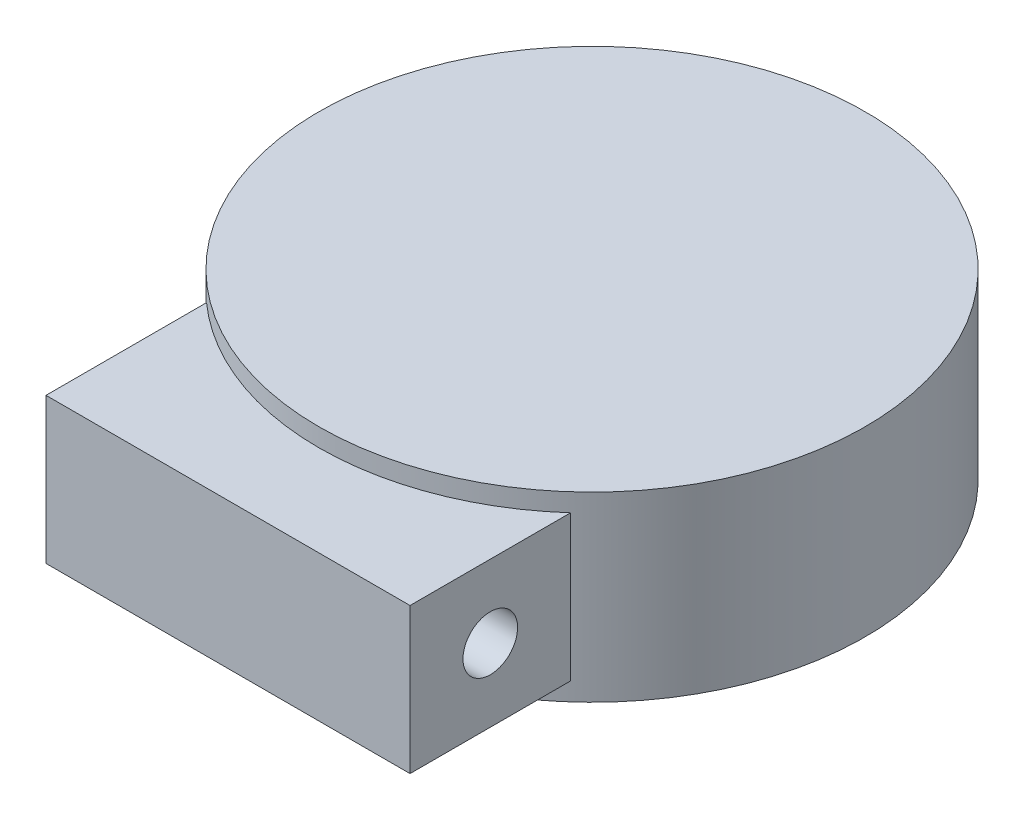
ISO-10303-21;
HEADER;
FILE_DESCRIPTION(('STEP AP214'),'2;1');
FILE_NAME('part.step','',(''),(''),'','','');
FILE_SCHEMA(('AUTOMOTIVE_DESIGN { 1 0 10303 214 1 1 1 1 }'));
ENDSEC;
DATA;
#1=APPLICATION_CONTEXT('core data for automotive mechanical design processes');
#2=APPLICATION_PROTOCOL_DEFINITION('international standard','automotive_design',2000,#1);
#3=PRODUCT_CONTEXT('',#1,'mechanical');
#4=PRODUCT('Part','Part','',(#3));
#5=PRODUCT_RELATED_PRODUCT_CATEGORY('part','',(#4));
#6=PRODUCT_DEFINITION_FORMATION('','',#4);
#7=PRODUCT_DEFINITION_CONTEXT('part definition',#1,'design');
#8=PRODUCT_DEFINITION('design','',#6,#7);
#9=PRODUCT_DEFINITION_SHAPE('','',#8);
#10=(LENGTH_UNIT() NAMED_UNIT(*) SI_UNIT(.MILLI.,.METRE.));
#11=(NAMED_UNIT(*) PLANE_ANGLE_UNIT() SI_UNIT($,.RADIAN.));
#12=(NAMED_UNIT(*) SI_UNIT($,.STERADIAN.) SOLID_ANGLE_UNIT());
#13=UNCERTAINTY_MEASURE_WITH_UNIT(LENGTH_MEASURE(1.E-05),#10,'distance_accuracy_value','');
#14=(GEOMETRIC_REPRESENTATION_CONTEXT(3) GLOBAL_UNCERTAINTY_ASSIGNED_CONTEXT((#13)) GLOBAL_UNIT_ASSIGNED_CONTEXT((#10,
#11,#12)) REPRESENTATION_CONTEXT('',''));
#15=CARTESIAN_POINT('',(0.,0.,0.));
#16=DIRECTION('',(0.,0.,1.));
#17=DIRECTION('',(1.,0.,0.));
#18=AXIS2_PLACEMENT_3D('',#15,#16,#17);
#19=CARTESIAN_POINT('',(0.,25.4,0.));
#20=DIRECTION('',(0.,-1.,0.));
#21=DIRECTION('',(0.,0.,-1.));
#22=AXIS2_PLACEMENT_3D('',#19,#20,#21);
#23=CYLINDRICAL_SURFACE('',#22,38.1);
#24=CARTESIAN_POINT('',(0.,0.,0.));
#25=DIRECTION('',(0.,1.,0.));
#26=DIRECTION('',(0.,0.,1.));
#27=AXIS2_PLACEMENT_3D('',#24,#25,#26);
#28=CIRCLE('',#27,38.1);
#29=CARTESIAN_POINT('',(0.,0.,38.1));
#30=VERTEX_POINT('',#29);
#31=EDGE_CURVE('E92',#30,#30,#28,.T.);
#32=ORIENTED_EDGE('',*,*,#31,.T.);
#33=EDGE_LOOP('',(#32));
#34=FACE_BOUND('',#33,.T.);
#35=CARTESIAN_POINT('',(0.,25.4,0.));
#36=DIRECTION('',(0.,1.,0.));
#37=DIRECTION('',(0.,0.,1.));
#38=AXIS2_PLACEMENT_3D('',#35,#36,#37);
#39=CIRCLE('',#38,38.1);
#40=CARTESIAN_POINT('',(0.,25.4,38.1));
#41=VERTEX_POINT('',#40);
#42=EDGE_CURVE('E95',#41,#41,#39,.T.);
#43=ORIENTED_EDGE('',*,*,#42,.F.);
#44=EDGE_LOOP('',(#43));
#45=FACE_BOUND('',#44,.T.);
#46=DIRECTION('',(0.,-1.,0.));
#47=VECTOR('',#46,1.);
#48=CARTESIAN_POINT('',(-25.4,25.4,28.3980633142473));
#49=LINE('',#48,#47);
#50=CARTESIAN_POINT('',(-25.4,22.86,28.3980633142473));
#51=VERTEX_POINT('',#50);
#52=CARTESIAN_POINT('',(-25.4,2.53999999999999,28.3980633142473));
#53=VERTEX_POINT('',#52);
#54=EDGE_CURVE('E11',#51,#53,#49,.T.);
#55=ORIENTED_EDGE('',*,*,#54,.F.);
#56=CARTESIAN_POINT('',(0.,22.86,0.));
#57=DIRECTION('',(0.,-1.,0.));
#58=DIRECTION('',(1.,0.,0.));
#59=AXIS2_PLACEMENT_3D('',#56,#57,#58);
#60=CIRCLE('',#59,38.1);
#61=CARTESIAN_POINT('',(25.4,22.86,28.3980633142473));
#62=VERTEX_POINT('',#61);
#63=EDGE_CURVE('E102',#62,#51,#60,.T.);
#64=ORIENTED_EDGE('',*,*,#63,.F.);
#65=DIRECTION('',(0.,-1.,0.));
#66=VECTOR('',#65,1.);
#67=CARTESIAN_POINT('',(25.4,25.4,28.3980633142473));
#68=LINE('',#67,#66);
#69=CARTESIAN_POINT('',(25.4,2.54,28.3980633142473));
#70=VERTEX_POINT('',#69);
#71=EDGE_CURVE('E51',#70,#62,#68,.F.);
#72=ORIENTED_EDGE('',*,*,#71,.F.);
#73=CARTESIAN_POINT('',(0.,2.54,0.));
#74=DIRECTION('',(0.,1.,0.));
#75=DIRECTION('',(-1.,0.,0.));
#76=AXIS2_PLACEMENT_3D('',#73,#74,#75);
#77=CIRCLE('',#76,38.1);
#78=EDGE_CURVE('E41',#53,#70,#77,.T.);
#79=ORIENTED_EDGE('',*,*,#78,.F.);
#80=EDGE_LOOP('',(#55,#64,#72,#79));
#81=FACE_BOUND('',#80,.T.);
#82=ADVANCED_FACE('F34',(#34,#45,#81),#23,.T.);
#83=CARTESIAN_POINT('',(0.,25.4,0.));
#84=DIRECTION('',(0.,1.,0.));
#85=DIRECTION('',(0.,0.,1.));
#86=AXIS2_PLACEMENT_3D('',#83,#84,#85);
#87=PLANE('',#86);
#88=ORIENTED_EDGE('',*,*,#42,.T.);
#89=EDGE_LOOP('',(#88));
#90=FACE_BOUND('',#89,.T.);
#91=ADVANCED_FACE('F117',(#90),#87,.T.);
#92=CARTESIAN_POINT('',(0.,0.,0.));
#93=DIRECTION('',(0.,1.,0.));
#94=DIRECTION('',(0.,0.,1.));
#95=AXIS2_PLACEMENT_3D('',#92,#93,#94);
#96=PLANE('',#95);
#97=ORIENTED_EDGE('',*,*,#31,.F.);
#98=EDGE_LOOP('',(#97));
#99=FACE_BOUND('',#98,.T.);
#100=ADVANCED_FACE('F122',(#99),#96,.F.);
#101=CARTESIAN_POINT('',(-25.4,22.86,50.8));
#102=DIRECTION('',(1.,0.,0.));
#103=DIRECTION('',(0.,1.,0.));
#104=AXIS2_PLACEMENT_3D('',#101,#102,#103);
#105=PLANE('',#104);
#106=CARTESIAN_POINT('',(-25.4,12.7,39.5990316571237));
#107=DIRECTION('',(-1.,0.,0.));
#108=DIRECTION('',(0.,-1.,0.));
#109=AXIS2_PLACEMENT_3D('',#106,#107,#108);
#110=CIRCLE('',#109,3.81);
#111=CARTESIAN_POINT('',(-25.4,8.88999999999999,39.5990316571237));
#112=VERTEX_POINT('',#111);
#113=EDGE_CURVE('E153',#112,#112,#110,.T.);
#114=ORIENTED_EDGE('',*,*,#113,.F.);
#115=EDGE_LOOP('',(#114));
#116=FACE_BOUND('',#115,.T.);
#117=DIRECTION('',(0.,0.,-1.));
#118=VECTOR('',#117,1.);
#119=CARTESIAN_POINT('',(-25.4,22.86,50.8));
#120=LINE('',#119,#118);
#121=CARTESIAN_POINT('',(-25.4,22.86,50.8));
#122=VERTEX_POINT('',#121);
#123=EDGE_CURVE('E111',#122,#51,#120,.T.);
#124=ORIENTED_EDGE('',*,*,#123,.T.);
#125=ORIENTED_EDGE('',*,*,#54,.T.);
#126=DIRECTION('',(0.,0.,-1.));
#127=VECTOR('',#126,1.);
#128=CARTESIAN_POINT('',(-25.4,2.53999999999999,50.8));
#129=LINE('',#128,#127);
#130=CARTESIAN_POINT('',(-25.4,2.53999999999999,50.8));
#131=VERTEX_POINT('',#130);
#132=EDGE_CURVE('E74',#131,#53,#129,.T.);
#133=ORIENTED_EDGE('',*,*,#132,.F.);
#134=DIRECTION('',(0.,-1.,0.));
#135=VECTOR('',#134,1.);
#136=CARTESIAN_POINT('',(-25.4,22.86,50.8));
#137=LINE('',#136,#135);
#138=EDGE_CURVE('E80',#122,#131,#137,.T.);
#139=ORIENTED_EDGE('',*,*,#138,.F.);
#140=EDGE_LOOP('',(#124,#125,#133,#139));
#141=FACE_BOUND('',#140,.T.);
#142=ADVANCED_FACE('F91',(#116,#141),#105,.F.);
#143=CARTESIAN_POINT('',(25.4,22.86,50.8));
#144=DIRECTION('',(-1.,0.,0.));
#145=DIRECTION('',(0.,-1.,0.));
#146=AXIS2_PLACEMENT_3D('',#143,#144,#145);
#147=PLANE('',#146);
#148=CARTESIAN_POINT('',(25.4,12.7,39.5990316571237));
#149=DIRECTION('',(-1.,0.,0.));
#150=DIRECTION('',(0.,-1.,0.));
#151=AXIS2_PLACEMENT_3D('',#148,#149,#150);
#152=CIRCLE('',#151,3.81);
#153=CARTESIAN_POINT('',(25.4,8.89,39.5990316571237));
#154=VERTEX_POINT('',#153);
#155=EDGE_CURVE('E89',#154,#154,#152,.F.);
#156=ORIENTED_EDGE('',*,*,#155,.F.);
#157=EDGE_LOOP('',(#156));
#158=FACE_BOUND('',#157,.T.);
#159=DIRECTION('',(0.,0.,-1.));
#160=VECTOR('',#159,1.);
#161=CARTESIAN_POINT('',(25.4,2.54,50.8));
#162=LINE('',#161,#160);
#163=CARTESIAN_POINT('',(25.4,2.54,50.8));
#164=VERTEX_POINT('',#163);
#165=EDGE_CURVE('E76',#164,#70,#162,.T.);
#166=ORIENTED_EDGE('',*,*,#165,.T.);
#167=ORIENTED_EDGE('',*,*,#71,.T.);
#168=DIRECTION('',(0.,0.,-1.));
#169=VECTOR('',#168,1.);
#170=CARTESIAN_POINT('',(25.4,22.86,50.8));
#171=LINE('',#170,#169);
#172=CARTESIAN_POINT('',(25.4,22.86,50.8));
#173=VERTEX_POINT('',#172);
#174=EDGE_CURVE('E97',#173,#62,#171,.T.);
#175=ORIENTED_EDGE('',*,*,#174,.F.);
#176=DIRECTION('',(0.,1.,0.));
#177=VECTOR('',#176,1.);
#178=CARTESIAN_POINT('',(25.4,22.86,50.8));
#179=LINE('',#178,#177);
#180=EDGE_CURVE('E79',#164,#173,#179,.T.);
#181=ORIENTED_EDGE('',*,*,#180,.F.);
#182=EDGE_LOOP('',(#166,#167,#175,#181));
#183=FACE_BOUND('',#182,.T.);
#184=ADVANCED_FACE('F107',(#158,#183),#147,.F.);
#185=CARTESIAN_POINT('',(25.4,2.54,50.8));
#186=DIRECTION('',(0.,1.,0.));
#187=DIRECTION('',(-1.,0.,0.));
#188=AXIS2_PLACEMENT_3D('',#185,#186,#187);
#189=PLANE('',#188);
#190=ORIENTED_EDGE('',*,*,#132,.T.);
#191=ORIENTED_EDGE('',*,*,#78,.T.);
#192=ORIENTED_EDGE('',*,*,#165,.F.);
#193=DIRECTION('',(1.,0.,0.));
#194=VECTOR('',#193,1.);
#195=CARTESIAN_POINT('',(25.4,2.54,50.8));
#196=LINE('',#195,#194);
#197=EDGE_CURVE('E70',#131,#164,#196,.T.);
#198=ORIENTED_EDGE('',*,*,#197,.F.);
#199=EDGE_LOOP('',(#190,#191,#192,#198));
#200=FACE_BOUND('',#199,.T.);
#201=ADVANCED_FACE('F72',(#200),#189,.F.);
#202=CARTESIAN_POINT('',(25.4,22.86,50.8));
#203=DIRECTION('',(0.,-1.,0.));
#204=DIRECTION('',(1.,0.,0.));
#205=AXIS2_PLACEMENT_3D('',#202,#203,#204);
#206=PLANE('',#205);
#207=ORIENTED_EDGE('',*,*,#174,.T.);
#208=ORIENTED_EDGE('',*,*,#63,.T.);
#209=ORIENTED_EDGE('',*,*,#123,.F.);
#210=DIRECTION('',(-1.,0.,0.));
#211=VECTOR('',#210,1.);
#212=CARTESIAN_POINT('',(25.4,22.86,50.8));
#213=LINE('',#212,#211);
#214=EDGE_CURVE('E85',#173,#122,#213,.T.);
#215=ORIENTED_EDGE('',*,*,#214,.F.);
#216=EDGE_LOOP('',(#207,#208,#209,#215));
#217=FACE_BOUND('',#216,.T.);
#218=ADVANCED_FACE('F115',(#217),#206,.F.);
#219=CARTESIAN_POINT('',(0.,0.,50.8));
#220=DIRECTION('',(0.,0.,-1.));
#221=DIRECTION('',(-1.,0.,0.));
#222=AXIS2_PLACEMENT_3D('',#219,#220,#221);
#223=PLANE('',#222);
#224=ORIENTED_EDGE('',*,*,#138,.T.);
#225=ORIENTED_EDGE('',*,*,#197,.T.);
#226=ORIENTED_EDGE('',*,*,#180,.T.);
#227=ORIENTED_EDGE('',*,*,#214,.T.);
#228=EDGE_LOOP('',(#224,#225,#226,#227));
#229=FACE_BOUND('',#228,.T.);
#230=ADVANCED_FACE('F83',(#229),#223,.F.);
#231=CARTESIAN_POINT('',(38.101,12.7,39.5990316571237));
#232=DIRECTION('',(-1.,0.,0.));
#233=DIRECTION('',(0.,-1.,0.));
#234=AXIS2_PLACEMENT_3D('',#231,#232,#233);
#235=CYLINDRICAL_SURFACE('',#234,3.81);
#236=ORIENTED_EDGE('',*,*,#113,.T.);
#237=EDGE_LOOP('',(#236));
#238=FACE_BOUND('',#237,.T.);
#239=ORIENTED_EDGE('',*,*,#155,.T.);
#240=EDGE_LOOP('',(#239));
#241=FACE_BOUND('',#240,.T.);
#242=ADVANCED_FACE('F145',(#238,#241),#235,.F.);
#243=CLOSED_SHELL('',(#82,#91,#100,#142,#184,#201,#218,#230,#242));
#244=MANIFOLD_SOLID_BREP('B2',#243);
#245=ADVANCED_BREP_SHAPE_REPRESENTATION('',(#18,#244),#14);
#246=SHAPE_DEFINITION_REPRESENTATION(#9,#245);
ENDSEC;
END-ISO-10303-21;
